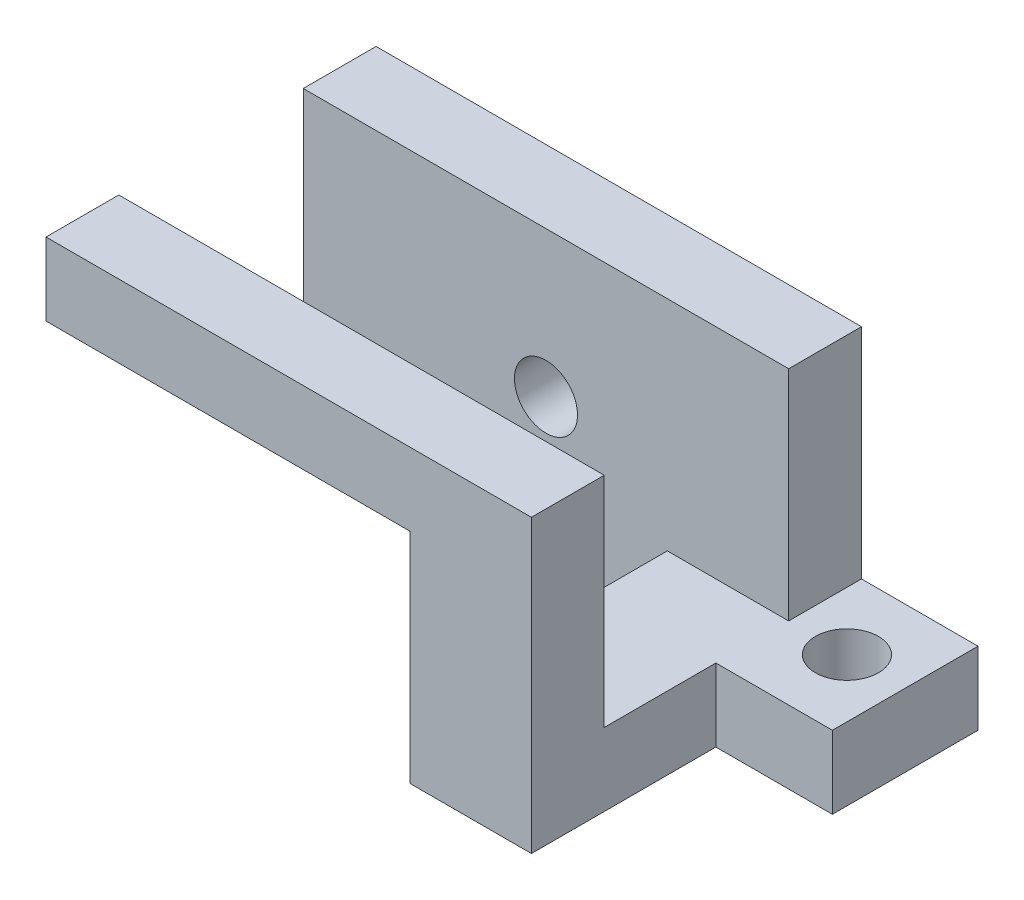
ISO-10303-21;
HEADER;
FILE_DESCRIPTION(('STEP AP214'),'2;1');
FILE_NAME('part.step','',(''),(''),'','','');
FILE_SCHEMA(('AUTOMOTIVE_DESIGN { 1 0 10303 214 1 1 1 1 }'));
ENDSEC;
DATA;
#1=APPLICATION_CONTEXT('core data for automotive mechanical design processes');
#2=APPLICATION_PROTOCOL_DEFINITION('international standard','automotive_design',2000,#1);
#3=PRODUCT_CONTEXT('',#1,'mechanical');
#4=PRODUCT('Part','Part','',(#3));
#5=PRODUCT_RELATED_PRODUCT_CATEGORY('part','',(#4));
#6=PRODUCT_DEFINITION_FORMATION('','',#4);
#7=PRODUCT_DEFINITION_CONTEXT('part definition',#1,'design');
#8=PRODUCT_DEFINITION('design','',#6,#7);
#9=PRODUCT_DEFINITION_SHAPE('','',#8);
#10=(LENGTH_UNIT() NAMED_UNIT(*) SI_UNIT(.MILLI.,.METRE.));
#11=(NAMED_UNIT(*) PLANE_ANGLE_UNIT() SI_UNIT($,.RADIAN.));
#12=(NAMED_UNIT(*) SI_UNIT($,.STERADIAN.) SOLID_ANGLE_UNIT());
#13=UNCERTAINTY_MEASURE_WITH_UNIT(LENGTH_MEASURE(1.E-05),#10,'distance_accuracy_value','');
#14=(GEOMETRIC_REPRESENTATION_CONTEXT(3) GLOBAL_UNCERTAINTY_ASSIGNED_CONTEXT((#13)) GLOBAL_UNIT_ASSIGNED_CONTEXT((#10,
#11,#12)) REPRESENTATION_CONTEXT('',''));
#15=CARTESIAN_POINT('',(0.,0.,0.));
#16=DIRECTION('',(0.,0.,1.));
#17=DIRECTION('',(1.,0.,0.));
#18=AXIS2_PLACEMENT_3D('',#15,#16,#17);
#19=CARTESIAN_POINT('',(-50.,0.,68.));
#20=DIRECTION('',(-1.,0.,0.));
#21=DIRECTION('',(0.,0.,1.));
#22=AXIS2_PLACEMENT_3D('',#19,#20,#21);
#23=PLANE('',#22);
#24=DIRECTION('',(0.,0.,-1.));
#25=VECTOR('',#24,1.);
#26=CARTESIAN_POINT('',(-50.,15.,68.000012));
#27=LINE('',#26,#25);
#28=CARTESIAN_POINT('',(-50.,15.,68.));
#29=VERTEX_POINT('',#28);
#30=CARTESIAN_POINT('',(-50.,15.,53.));
#31=VERTEX_POINT('',#30);
#32=EDGE_CURVE('E59',#29,#31,#27,.T.);
#33=ORIENTED_EDGE('',*,*,#32,.F.);
#34=DIRECTION('',(0.,1.,0.));
#35=VECTOR('',#34,1.);
#36=CARTESIAN_POINT('',(-50.,0.,68.));
#37=LINE('',#36,#35);
#38=CARTESIAN_POINT('',(-50.,30.,68.));
#39=VERTEX_POINT('',#38);
#40=EDGE_CURVE('E184',#29,#39,#37,.T.);
#41=ORIENTED_EDGE('',*,*,#40,.T.);
#42=DIRECTION('',(0.,0.,-1.));
#43=VECTOR('',#42,1.);
#44=CARTESIAN_POINT('',(-50.,30.,68.));
#45=LINE('',#44,#43);
#46=CARTESIAN_POINT('',(-50.,30.,53.));
#47=VERTEX_POINT('',#46);
#48=EDGE_CURVE('E266',#39,#47,#45,.T.);
#49=ORIENTED_EDGE('',*,*,#48,.T.);
#50=DIRECTION('',(0.,-1.,0.));
#51=VECTOR('',#50,1.);
#52=CARTESIAN_POINT('',(-50.,0.,53.));
#53=LINE('',#52,#51);
#54=EDGE_CURVE('E173',#47,#31,#53,.T.);
#55=ORIENTED_EDGE('',*,*,#54,.T.);
#56=EDGE_LOOP('',(#33,#41,#49,#55));
#57=FACE_BOUND('',#56,.T.);
#58=ADVANCED_FACE('F39',(#57),#23,.T.);
#59=CARTESIAN_POINT('',(0.,-30.,68.));
#60=DIRECTION('',(0.,1.,0.));
#61=DIRECTION('',(0.,0.,1.));
#62=AXIS2_PLACEMENT_3D('',#59,#60,#61);
#63=PLANE('',#62);
#64=CARTESIAN_POINT('',(62.,-30.,15.));
#65=DIRECTION('',(0.,1.,0.));
#66=DIRECTION('',(0.,0.,1.));
#67=AXIS2_PLACEMENT_3D('',#64,#65,#66);
#68=CIRCLE('',#67,6.5);
#69=CARTESIAN_POINT('',(62.,-30.,21.5));
#70=VERTEX_POINT('',#69);
#71=EDGE_CURVE('E226',#70,#70,#68,.T.);
#72=ORIENTED_EDGE('',*,*,#71,.T.);
#73=EDGE_LOOP('',(#72));
#74=FACE_BOUND('',#73,.T.);
#75=DIRECTION('',(1.,0.,0.));
#76=VECTOR('',#75,1.);
#77=CARTESIAN_POINT('',(0.,-30.,15.));
#78=LINE('',#77,#76);
#79=CARTESIAN_POINT('',(-50.,-30.,15.));
#80=VERTEX_POINT('',#79);
#81=CARTESIAN_POINT('',(25.,-30.,15.));
#82=VERTEX_POINT('',#81);
#83=EDGE_CURVE('E194',#80,#82,#78,.T.);
#84=ORIENTED_EDGE('',*,*,#83,.F.);
#85=DIRECTION('',(0.,0.,-1.));
#86=VECTOR('',#85,1.);
#87=CARTESIAN_POINT('',(-50.,-30.,68.));
#88=LINE('',#87,#86);
#89=CARTESIAN_POINT('',(-50.,-30.,0.));
#90=VERTEX_POINT('',#89);
#91=EDGE_CURVE('E143',#80,#90,#88,.T.);
#92=ORIENTED_EDGE('',*,*,#91,.T.);
#93=DIRECTION('',(1.,0.,0.));
#94=VECTOR('',#93,1.);
#95=CARTESIAN_POINT('',(0.,-30.,0.));
#96=LINE('',#95,#94);
#97=CARTESIAN_POINT('',(74.,-30.,0.));
#98=VERTEX_POINT('',#97);
#99=EDGE_CURVE('E258',#90,#98,#96,.T.);
#100=ORIENTED_EDGE('',*,*,#99,.T.);
#101=DIRECTION('',(0.,0.,-1.));
#102=VECTOR('',#101,1.);
#103=CARTESIAN_POINT('',(74.,-30.,30.));
#104=LINE('',#103,#102);
#105=CARTESIAN_POINT('',(74.,-30.,30.));
#106=VERTEX_POINT('',#105);
#107=EDGE_CURVE('E245',#106,#98,#104,.T.);
#108=ORIENTED_EDGE('',*,*,#107,.F.);
#109=DIRECTION('',(1.,0.,0.));
#110=VECTOR('',#109,1.);
#111=CARTESIAN_POINT('',(0.,-30.,30.));
#112=LINE('',#111,#110);
#113=CARTESIAN_POINT('',(50.,-30.,30.));
#114=VERTEX_POINT('',#113);
#115=EDGE_CURVE('E166',#114,#106,#112,.T.);
#116=ORIENTED_EDGE('',*,*,#115,.F.);
#117=DIRECTION('',(0.,0.,-1.));
#118=VECTOR('',#117,1.);
#119=CARTESIAN_POINT('',(50.,-30.,68.));
#120=LINE('',#119,#118);
#121=CARTESIAN_POINT('',(50.,-30.,68.));
#122=VERTEX_POINT('',#121);
#123=EDGE_CURVE('E161',#122,#114,#120,.T.);
#124=ORIENTED_EDGE('',*,*,#123,.F.);
#125=DIRECTION('',(1.,0.,0.));
#126=VECTOR('',#125,1.);
#127=CARTESIAN_POINT('',(0.,-30.,68.));
#128=LINE('',#127,#126);
#129=CARTESIAN_POINT('',(25.,-30.,68.));
#130=VERTEX_POINT('',#129);
#131=EDGE_CURVE('E148',#130,#122,#128,.T.);
#132=ORIENTED_EDGE('',*,*,#131,.F.);
#133=DIRECTION('',(0.,0.,-1.));
#134=VECTOR('',#133,1.);
#135=CARTESIAN_POINT('',(25.,-30.,68.000012));
#136=LINE('',#135,#134);
#137=EDGE_CURVE('E80',#130,#82,#136,.T.);
#138=ORIENTED_EDGE('',*,*,#137,.T.);
#139=EDGE_LOOP('',(#84,#92,#100,#108,#116,#124,#132,#138));
#140=FACE_BOUND('',#139,.T.);
#141=ADVANCED_FACE('F41',(#74,#140),#63,.F.);
#142=CARTESIAN_POINT('',(0.,-15.,30.));
#143=DIRECTION('',(0.,-1.,0.));
#144=DIRECTION('',(0.,0.,-1.));
#145=AXIS2_PLACEMENT_3D('',#142,#143,#144);
#146=PLANE('',#145);
#147=CARTESIAN_POINT('',(62.,-15.,15.));
#148=DIRECTION('',(0.,1.,0.));
#149=DIRECTION('',(0.,0.,1.));
#150=AXIS2_PLACEMENT_3D('',#147,#148,#149);
#151=CIRCLE('',#150,6.5);
#152=CARTESIAN_POINT('',(62.,-15.,21.5));
#153=VERTEX_POINT('',#152);
#154=EDGE_CURVE('E225',#153,#153,#151,.T.);
#155=ORIENTED_EDGE('',*,*,#154,.F.);
#156=EDGE_LOOP('',(#155));
#157=FACE_BOUND('',#156,.T.);
#158=DIRECTION('',(0.,0.,-1.));
#159=VECTOR('',#158,1.);
#160=CARTESIAN_POINT('',(25.,-15.,30.));
#161=LINE('',#160,#159);
#162=CARTESIAN_POINT('',(25.,-15.,53.));
#163=VERTEX_POINT('',#162);
#164=CARTESIAN_POINT('',(25.,-15.,15.));
#165=VERTEX_POINT('',#164);
#166=EDGE_CURVE('E208',#163,#165,#161,.T.);
#167=ORIENTED_EDGE('',*,*,#166,.F.);
#168=DIRECTION('',(1.,0.,0.));
#169=VECTOR('',#168,1.);
#170=CARTESIAN_POINT('',(-63.,-15.,53.));
#171=LINE('',#170,#169);
#172=CARTESIAN_POINT('',(50.,-15.,53.));
#173=VERTEX_POINT('',#172);
#174=EDGE_CURVE('E223',#163,#173,#171,.T.);
#175=ORIENTED_EDGE('',*,*,#174,.T.);
#176=DIRECTION('',(0.,0.,1.));
#177=VECTOR('',#176,1.);
#178=CARTESIAN_POINT('',(50.,-15.,15.));
#179=LINE('',#178,#177);
#180=CARTESIAN_POINT('',(50.,-15.,30.));
#181=VERTEX_POINT('',#180);
#182=EDGE_CURVE('E213',#181,#173,#179,.T.);
#183=ORIENTED_EDGE('',*,*,#182,.F.);
#184=DIRECTION('',(-1.,0.,0.));
#185=VECTOR('',#184,1.);
#186=CARTESIAN_POINT('',(0.,-15.,30.));
#187=LINE('',#186,#185);
#188=CARTESIAN_POINT('',(74.,-15.,30.));
#189=VERTEX_POINT('',#188);
#190=EDGE_CURVE('E240',#189,#181,#187,.T.);
#191=ORIENTED_EDGE('',*,*,#190,.F.);
#192=DIRECTION('',(0.,0.,-1.));
#193=VECTOR('',#192,1.);
#194=CARTESIAN_POINT('',(74.,-15.,30.));
#195=LINE('',#194,#193);
#196=CARTESIAN_POINT('',(74.,-15.,0.));
#197=VERTEX_POINT('',#196);
#198=EDGE_CURVE('E251',#189,#197,#195,.T.);
#199=ORIENTED_EDGE('',*,*,#198,.T.);
#200=DIRECTION('',(-1.,0.,0.));
#201=VECTOR('',#200,1.);
#202=CARTESIAN_POINT('',(0.,-15.,0.));
#203=LINE('',#202,#201);
#204=CARTESIAN_POINT('',(50.,-15.,0.));
#205=VERTEX_POINT('',#204);
#206=EDGE_CURVE('E236',#197,#205,#203,.T.);
#207=ORIENTED_EDGE('',*,*,#206,.T.);
#208=DIRECTION('',(0.,0.,-1.));
#209=VECTOR('',#208,1.);
#210=CARTESIAN_POINT('',(50.,-15.,30.));
#211=LINE('',#210,#209);
#212=CARTESIAN_POINT('',(50.,-15.,15.));
#213=VERTEX_POINT('',#212);
#214=EDGE_CURVE('E253',#213,#205,#211,.T.);
#215=ORIENTED_EDGE('',*,*,#214,.F.);
#216=DIRECTION('',(1.,0.,0.));
#217=VECTOR('',#216,1.);
#218=CARTESIAN_POINT('',(-63.,-15.,15.));
#219=LINE('',#218,#217);
#220=EDGE_CURVE('E224',#165,#213,#219,.T.);
#221=ORIENTED_EDGE('',*,*,#220,.F.);
#222=EDGE_LOOP('',(#167,#175,#183,#191,#199,#207,#215,#221));
#223=FACE_BOUND('',#222,.T.);
#224=ADVANCED_FACE('F288',(#157,#223),#146,.F.);
#225=CARTESIAN_POINT('',(-63.,-15.,53.));
#226=DIRECTION('',(0.,0.,-1.));
#227=DIRECTION('',(-1.,0.,0.));
#228=AXIS2_PLACEMENT_3D('',#225,#226,#227);
#229=PLANE('',#228);
#230=ORIENTED_EDGE('',*,*,#174,.F.);
#231=DIRECTION('',(0.,1.,0.));
#232=VECTOR('',#231,1.);
#233=CARTESIAN_POINT('',(25.,-15.,53.));
#234=LINE('',#233,#232);
#235=CARTESIAN_POINT('',(25.,15.,53.));
#236=VERTEX_POINT('',#235);
#237=EDGE_CURVE('E11',#163,#236,#234,.T.);
#238=ORIENTED_EDGE('',*,*,#237,.T.);
#239=DIRECTION('',(-1.,0.,0.));
#240=VECTOR('',#239,1.);
#241=CARTESIAN_POINT('',(-63.,15.,53.));
#242=LINE('',#241,#240);
#243=EDGE_CURVE('E47',#236,#31,#242,.T.);
#244=ORIENTED_EDGE('',*,*,#243,.T.);
#245=ORIENTED_EDGE('',*,*,#54,.F.);
#246=DIRECTION('',(1.,0.,0.));
#247=VECTOR('',#246,1.);
#248=CARTESIAN_POINT('',(-63.,30.,53.));
#249=LINE('',#248,#247);
#250=CARTESIAN_POINT('',(50.,30.,53.));
#251=VERTEX_POINT('',#250);
#252=EDGE_CURVE('E217',#47,#251,#249,.T.);
#253=ORIENTED_EDGE('',*,*,#252,.T.);
#254=DIRECTION('',(0.,1.,0.));
#255=VECTOR('',#254,1.);
#256=CARTESIAN_POINT('',(50.,-15.,53.));
#257=LINE('',#256,#255);
#258=EDGE_CURVE('E211',#173,#251,#257,.T.);
#259=ORIENTED_EDGE('',*,*,#258,.F.);
#260=EDGE_LOOP('',(#230,#238,#244,#245,#253,#259));
#261=FACE_BOUND('',#260,.T.);
#262=ADVANCED_FACE('F300',(#261),#229,.T.);
#263=CARTESIAN_POINT('',(50.,0.,68.));
#264=DIRECTION('',(-1.,0.,0.));
#265=DIRECTION('',(0.,0.,1.));
#266=AXIS2_PLACEMENT_3D('',#263,#264,#265);
#267=PLANE('',#266);
#268=ORIENTED_EDGE('',*,*,#182,.T.);
#269=ORIENTED_EDGE('',*,*,#258,.T.);
#270=DIRECTION('',(0.,0.,-1.));
#271=VECTOR('',#270,1.);
#272=CARTESIAN_POINT('',(50.,30.,68.));
#273=LINE('',#272,#271);
#274=CARTESIAN_POINT('',(50.,30.,68.));
#275=VERTEX_POINT('',#274);
#276=EDGE_CURVE('E163',#275,#251,#273,.T.);
#277=ORIENTED_EDGE('',*,*,#276,.F.);
#278=DIRECTION('',(0.,1.,0.));
#279=VECTOR('',#278,1.);
#280=CARTESIAN_POINT('',(50.,0.,68.));
#281=LINE('',#280,#279);
#282=EDGE_CURVE('E147',#122,#275,#281,.T.);
#283=ORIENTED_EDGE('',*,*,#282,.F.);
#284=ORIENTED_EDGE('',*,*,#123,.T.);
#285=DIRECTION('',(0.,1.,0.));
#286=VECTOR('',#285,1.);
#287=CARTESIAN_POINT('',(50.,0.,30.));
#288=LINE('',#287,#286);
#289=EDGE_CURVE('E243',#114,#181,#288,.T.);
#290=ORIENTED_EDGE('',*,*,#289,.T.);
#291=EDGE_LOOP('',(#268,#269,#277,#283,#284,#290));
#292=FACE_BOUND('',#291,.T.);
#293=ADVANCED_FACE('F157',(#292),#267,.F.);
#294=CARTESIAN_POINT('',(0.,30.,68.));
#295=DIRECTION('',(0.,1.,0.));
#296=DIRECTION('',(0.,0.,1.));
#297=AXIS2_PLACEMENT_3D('',#294,#295,#296);
#298=PLANE('',#297);
#299=CARTESIAN_POINT('',(-50.,30.,15.));
#300=VERTEX_POINT('',#299);
#301=CARTESIAN_POINT('',(-50.,30.,0.));
#302=VERTEX_POINT('',#301);
#303=EDGE_CURVE('E181',#300,#302,#45,.T.);
#304=ORIENTED_EDGE('',*,*,#303,.F.);
#305=DIRECTION('',(1.,0.,0.));
#306=VECTOR('',#305,1.);
#307=CARTESIAN_POINT('',(-63.,30.,15.));
#308=LINE('',#307,#306);
#309=CARTESIAN_POINT('',(50.,30.,15.));
#310=VERTEX_POINT('',#309);
#311=EDGE_CURVE('E218',#300,#310,#308,.T.);
#312=ORIENTED_EDGE('',*,*,#311,.T.);
#313=CARTESIAN_POINT('',(50.,30.,0.));
#314=VERTEX_POINT('',#313);
#315=EDGE_CURVE('E176',#310,#314,#273,.T.);
#316=ORIENTED_EDGE('',*,*,#315,.T.);
#317=DIRECTION('',(1.,0.,0.));
#318=VECTOR('',#317,1.);
#319=CARTESIAN_POINT('',(0.,30.,0.));
#320=LINE('',#319,#318);
#321=EDGE_CURVE('E261',#302,#314,#320,.T.);
#322=ORIENTED_EDGE('',*,*,#321,.F.);
#323=EDGE_LOOP('',(#304,#312,#316,#322));
#324=FACE_BOUND('',#323,.T.);
#325=ADVANCED_FACE('F272',(#324),#298,.T.);
#326=ORIENTED_EDGE('',*,*,#91,.F.);
#327=DIRECTION('',(0.,1.,0.));
#328=VECTOR('',#327,1.);
#329=CARTESIAN_POINT('',(-50.,0.,15.));
#330=LINE('',#329,#328);
#331=EDGE_CURVE('E175',#80,#300,#330,.T.);
#332=ORIENTED_EDGE('',*,*,#331,.T.);
#333=ORIENTED_EDGE('',*,*,#303,.T.);
#334=DIRECTION('',(0.,1.,0.));
#335=VECTOR('',#334,1.);
#336=CARTESIAN_POINT('',(-50.,0.,0.));
#337=LINE('',#336,#335);
#338=EDGE_CURVE('E154',#90,#302,#337,.T.);
#339=ORIENTED_EDGE('',*,*,#338,.F.);
#340=EDGE_LOOP('',(#326,#332,#333,#339));
#341=FACE_BOUND('',#340,.T.);
#342=ADVANCED_FACE('F284',(#341),#23,.T.);
#343=ORIENTED_EDGE('',*,*,#315,.F.);
#344=DIRECTION('',(0.,-1.,0.));
#345=VECTOR('',#344,1.);
#346=CARTESIAN_POINT('',(50.,30.,15.));
#347=LINE('',#346,#345);
#348=EDGE_CURVE('E214',#310,#213,#347,.T.);
#349=ORIENTED_EDGE('',*,*,#348,.T.);
#350=ORIENTED_EDGE('',*,*,#214,.T.);
#351=DIRECTION('',(0.,1.,0.));
#352=VECTOR('',#351,1.);
#353=CARTESIAN_POINT('',(50.,0.,0.));
#354=LINE('',#353,#352);
#355=EDGE_CURVE('E256',#205,#314,#354,.T.);
#356=ORIENTED_EDGE('',*,*,#355,.T.);
#357=EDGE_LOOP('',(#343,#349,#350,#356));
#358=FACE_BOUND('',#357,.T.);
#359=ADVANCED_FACE('F280',(#358),#267,.F.);
#360=ORIENTED_EDGE('',*,*,#252,.F.);
#361=ORIENTED_EDGE('',*,*,#48,.F.);
#362=DIRECTION('',(1.,0.,0.));
#363=VECTOR('',#362,1.);
#364=CARTESIAN_POINT('',(0.,30.,68.));
#365=LINE('',#364,#363);
#366=EDGE_CURVE('E167',#39,#275,#365,.T.);
#367=ORIENTED_EDGE('',*,*,#366,.T.);
#368=ORIENTED_EDGE('',*,*,#276,.T.);
#369=EDGE_LOOP('',(#360,#361,#367,#368));
#370=FACE_BOUND('',#369,.T.);
#371=ADVANCED_FACE('F301',(#370),#298,.T.);
#372=CARTESIAN_POINT('',(0.,0.,68.));
#373=DIRECTION('',(0.,0.,1.));
#374=DIRECTION('',(1.,0.,0.));
#375=AXIS2_PLACEMENT_3D('',#372,#373,#374);
#376=PLANE('',#375);
#377=DIRECTION('',(0.,1.,0.));
#378=VECTOR('',#377,1.);
#379=CARTESIAN_POINT('',(25.,0.,68.));
#380=LINE('',#379,#378);
#381=CARTESIAN_POINT('',(25.,15.,68.));
#382=VERTEX_POINT('',#381);
#383=EDGE_CURVE('E153',#130,#382,#380,.T.);
#384=ORIENTED_EDGE('',*,*,#383,.F.);
#385=ORIENTED_EDGE('',*,*,#131,.T.);
#386=ORIENTED_EDGE('',*,*,#282,.T.);
#387=ORIENTED_EDGE('',*,*,#366,.F.);
#388=ORIENTED_EDGE('',*,*,#40,.F.);
#389=DIRECTION('',(-1.,0.,0.));
#390=VECTOR('',#389,1.);
#391=CARTESIAN_POINT('',(0.,15.,68.));
#392=LINE('',#391,#390);
#393=EDGE_CURVE('E183',#382,#29,#392,.T.);
#394=ORIENTED_EDGE('',*,*,#393,.F.);
#395=EDGE_LOOP('',(#384,#385,#386,#387,#388,#394));
#396=FACE_BOUND('',#395,.T.);
#397=ADVANCED_FACE('F146',(#396),#376,.T.);
#398=CARTESIAN_POINT('',(0.,0.,0.));
#399=DIRECTION('',(0.,0.,1.));
#400=DIRECTION('',(1.,0.,0.));
#401=AXIS2_PLACEMENT_3D('',#398,#399,#400);
#402=PLANE('',#401);
#403=CARTESIAN_POINT('',(0.,0.,0.));
#404=DIRECTION('',(0.,0.,-1.));
#405=DIRECTION('',(-1.,0.,0.));
#406=AXIS2_PLACEMENT_3D('',#403,#404,#405);
#407=CIRCLE('',#406,6.5);
#408=CARTESIAN_POINT('',(-6.5,0.,0.));
#409=VERTEX_POINT('',#408);
#410=EDGE_CURVE('E358',#409,#409,#407,.T.);
#411=ORIENTED_EDGE('',*,*,#410,.F.);
#412=EDGE_LOOP('',(#411));
#413=FACE_BOUND('',#412,.T.);
#414=ORIENTED_EDGE('',*,*,#99,.F.);
#415=ORIENTED_EDGE('',*,*,#338,.T.);
#416=ORIENTED_EDGE('',*,*,#321,.T.);
#417=ORIENTED_EDGE('',*,*,#355,.F.);
#418=ORIENTED_EDGE('',*,*,#206,.F.);
#419=DIRECTION('',(0.,1.,0.));
#420=VECTOR('',#419,1.);
#421=CARTESIAN_POINT('',(74.,0.,0.));
#422=LINE('',#421,#420);
#423=EDGE_CURVE('E232',#98,#197,#422,.T.);
#424=ORIENTED_EDGE('',*,*,#423,.F.);
#425=EDGE_LOOP('',(#414,#415,#416,#417,#418,#424));
#426=FACE_BOUND('',#425,.T.);
#427=ADVANCED_FACE('F278',(#413,#426),#402,.F.);
#428=CARTESIAN_POINT('',(74.,0.,30.));
#429=DIRECTION('',(-1.,0.,0.));
#430=DIRECTION('',(0.,0.,1.));
#431=AXIS2_PLACEMENT_3D('',#428,#429,#430);
#432=PLANE('',#431);
#433=ORIENTED_EDGE('',*,*,#423,.T.);
#434=ORIENTED_EDGE('',*,*,#198,.F.);
#435=DIRECTION('',(0.,1.,0.));
#436=VECTOR('',#435,1.);
#437=CARTESIAN_POINT('',(74.,0.,30.));
#438=LINE('',#437,#436);
#439=EDGE_CURVE('E233',#106,#189,#438,.T.);
#440=ORIENTED_EDGE('',*,*,#439,.F.);
#441=ORIENTED_EDGE('',*,*,#107,.T.);
#442=EDGE_LOOP('',(#433,#434,#440,#441));
#443=FACE_BOUND('',#442,.T.);
#444=ADVANCED_FACE('F291',(#443),#432,.F.);
#445=CARTESIAN_POINT('',(0.,0.,30.));
#446=DIRECTION('',(0.,0.,1.));
#447=DIRECTION('',(1.,0.,0.));
#448=AXIS2_PLACEMENT_3D('',#445,#446,#447);
#449=PLANE('',#448);
#450=ORIENTED_EDGE('',*,*,#439,.T.);
#451=ORIENTED_EDGE('',*,*,#190,.T.);
#452=ORIENTED_EDGE('',*,*,#289,.F.);
#453=ORIENTED_EDGE('',*,*,#115,.T.);
#454=EDGE_LOOP('',(#450,#451,#452,#453));
#455=FACE_BOUND('',#454,.T.);
#456=ADVANCED_FACE('F298',(#455),#449,.T.);
#457=CARTESIAN_POINT('',(62.,-55.,15.));
#458=DIRECTION('',(0.,1.,0.));
#459=DIRECTION('',(0.,0.,1.));
#460=AXIS2_PLACEMENT_3D('',#457,#458,#459);
#461=CYLINDRICAL_SURFACE('',#460,6.5);
#462=ORIENTED_EDGE('',*,*,#154,.T.);
#463=EDGE_LOOP('',(#462));
#464=FACE_BOUND('',#463,.T.);
#465=ORIENTED_EDGE('',*,*,#71,.F.);
#466=EDGE_LOOP('',(#465));
#467=FACE_BOUND('',#466,.T.);
#468=ADVANCED_FACE('F337',(#464,#467),#461,.F.);
#469=CARTESIAN_POINT('',(-63.,30.,15.));
#470=DIRECTION('',(0.,0.,1.));
#471=DIRECTION('',(0.,-1.,0.));
#472=AXIS2_PLACEMENT_3D('',#469,#470,#471);
#473=PLANE('',#472);
#474=CARTESIAN_POINT('',(0.,0.,15.));
#475=DIRECTION('',(0.,0.,1.));
#476=DIRECTION('',(0.,-1.,0.));
#477=AXIS2_PLACEMENT_3D('',#474,#475,#476);
#478=CIRCLE('',#477,6.5);
#479=CARTESIAN_POINT('',(0.,-6.5,15.));
#480=VERTEX_POINT('',#479);
#481=EDGE_CURVE('E43',#480,#480,#478,.T.);
#482=ORIENTED_EDGE('',*,*,#481,.F.);
#483=EDGE_LOOP('',(#482));
#484=FACE_BOUND('',#483,.T.);
#485=DIRECTION('',(0.,1.,0.));
#486=VECTOR('',#485,1.);
#487=CARTESIAN_POINT('',(25.,0.,15.));
#488=LINE('',#487,#486);
#489=EDGE_CURVE('E197',#82,#165,#488,.T.);
#490=ORIENTED_EDGE('',*,*,#489,.T.);
#491=ORIENTED_EDGE('',*,*,#220,.T.);
#492=ORIENTED_EDGE('',*,*,#348,.F.);
#493=ORIENTED_EDGE('',*,*,#311,.F.);
#494=ORIENTED_EDGE('',*,*,#331,.F.);
#495=ORIENTED_EDGE('',*,*,#83,.T.);
#496=EDGE_LOOP('',(#490,#491,#492,#493,#494,#495));
#497=FACE_BOUND('',#496,.T.);
#498=ADVANCED_FACE('F290',(#484,#497),#473,.T.);
#499=CARTESIAN_POINT('',(25.,0.,68.000012));
#500=DIRECTION('',(-1.,0.,0.));
#501=DIRECTION('',(0.,0.,1.));
#502=AXIS2_PLACEMENT_3D('',#499,#500,#501);
#503=PLANE('',#502);
#504=ORIENTED_EDGE('',*,*,#166,.T.);
#505=ORIENTED_EDGE('',*,*,#489,.F.);
#506=ORIENTED_EDGE('',*,*,#137,.F.);
#507=ORIENTED_EDGE('',*,*,#383,.T.);
#508=DIRECTION('',(0.,0.,-1.));
#509=VECTOR('',#508,1.);
#510=CARTESIAN_POINT('',(25.,15.,68.000012));
#511=LINE('',#510,#509);
#512=EDGE_CURVE('E206',#382,#236,#511,.T.);
#513=ORIENTED_EDGE('',*,*,#512,.T.);
#514=ORIENTED_EDGE('',*,*,#237,.F.);
#515=EDGE_LOOP('',(#504,#505,#506,#507,#513,#514));
#516=FACE_BOUND('',#515,.T.);
#517=ADVANCED_FACE('F285',(#516),#503,.T.);
#518=CARTESIAN_POINT('',(0.,15.,68.000012));
#519=DIRECTION('',(0.,-1.,0.));
#520=DIRECTION('',(1.,0.,0.));
#521=AXIS2_PLACEMENT_3D('',#518,#519,#520);
#522=PLANE('',#521);
#523=ORIENTED_EDGE('',*,*,#512,.F.);
#524=ORIENTED_EDGE('',*,*,#393,.T.);
#525=ORIENTED_EDGE('',*,*,#32,.T.);
#526=ORIENTED_EDGE('',*,*,#243,.F.);
#527=EDGE_LOOP('',(#523,#524,#525,#526));
#528=FACE_BOUND('',#527,.T.);
#529=ADVANCED_FACE('F305',(#528),#522,.T.);
#530=CARTESIAN_POINT('',(0.,0.,38.));
#531=DIRECTION('',(0.,0.,-1.));
#532=DIRECTION('',(-1.,0.,0.));
#533=AXIS2_PLACEMENT_3D('',#530,#531,#532);
#534=CYLINDRICAL_SURFACE('',#533,6.5);
#535=ORIENTED_EDGE('',*,*,#481,.T.);
#536=EDGE_LOOP('',(#535));
#537=FACE_BOUND('',#536,.T.);
#538=ORIENTED_EDGE('',*,*,#410,.T.);
#539=EDGE_LOOP('',(#538));
#540=FACE_BOUND('',#539,.T.);
#541=ADVANCED_FACE('F349',(#537,#540),#534,.F.);
#542=CLOSED_SHELL('',(#58,#141,#224,#262,#293,#325,#342,#359,#371,#397,#427,#444,#456,#468,#498,
#517,#529,#541));
#543=MANIFOLD_SOLID_BREP('B2',#542);
#544=ADVANCED_BREP_SHAPE_REPRESENTATION('',(#18,#543),#14);
#545=SHAPE_DEFINITION_REPRESENTATION(#9,#544);
ENDSEC;
END-ISO-10303-21;
